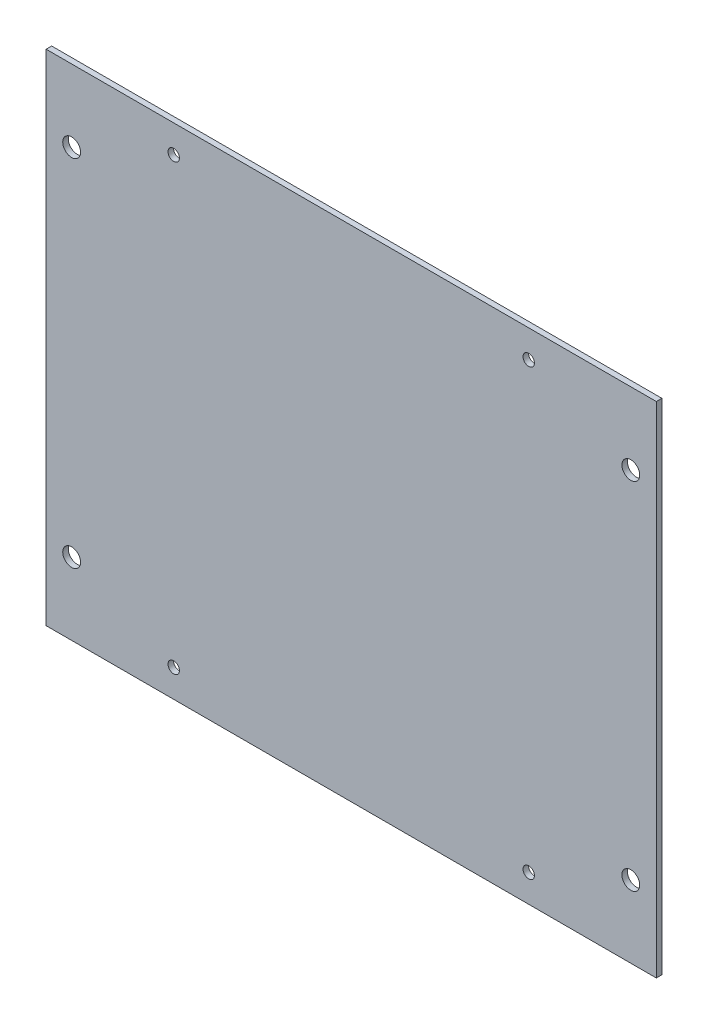
ISO-10303-21;
HEADER;
FILE_DESCRIPTION(('STEP AP214'),'2;1');
FILE_NAME('part.step','',(''),(''),'','','');
FILE_SCHEMA(('AUTOMOTIVE_DESIGN { 1 0 10303 214 1 1 1 1 }'));
ENDSEC;
DATA;
#1=APPLICATION_CONTEXT('core data for automotive mechanical design processes');
#2=APPLICATION_PROTOCOL_DEFINITION('international standard','automotive_design',2000,#1);
#3=PRODUCT_CONTEXT('',#1,'mechanical');
#4=PRODUCT('Part','Part','',(#3));
#5=PRODUCT_RELATED_PRODUCT_CATEGORY('part','',(#4));
#6=PRODUCT_DEFINITION_FORMATION('','',#4);
#7=PRODUCT_DEFINITION_CONTEXT('part definition',#1,'design');
#8=PRODUCT_DEFINITION('design','',#6,#7);
#9=PRODUCT_DEFINITION_SHAPE('','',#8);
#10=(LENGTH_UNIT() NAMED_UNIT(*) SI_UNIT(.MILLI.,.METRE.));
#11=(NAMED_UNIT(*) PLANE_ANGLE_UNIT() SI_UNIT($,.RADIAN.));
#12=(NAMED_UNIT(*) SI_UNIT($,.STERADIAN.) SOLID_ANGLE_UNIT());
#13=UNCERTAINTY_MEASURE_WITH_UNIT(LENGTH_MEASURE(1.E-05),#10,'distance_accuracy_value','');
#14=(GEOMETRIC_REPRESENTATION_CONTEXT(3) GLOBAL_UNCERTAINTY_ASSIGNED_CONTEXT((#13)) GLOBAL_UNIT_ASSIGNED_CONTEXT((#10,
#11,#12)) REPRESENTATION_CONTEXT('',''));
#15=CARTESIAN_POINT('',(0.,0.,0.));
#16=DIRECTION('',(0.,0.,1.));
#17=DIRECTION('',(1.,0.,0.));
#18=AXIS2_PLACEMENT_3D('',#15,#16,#17);
#19=CARTESIAN_POINT('',(0.,0.,0.79375));
#20=DIRECTION('',(0.,0.,1.));
#21=DIRECTION('',(1.,0.,0.));
#22=AXIS2_PLACEMENT_3D('',#19,#20,#21);
#23=PLANE('',#22);
#24=CARTESIAN_POINT('',(-220.027325222367,1.5302583045204,0.79375));
#25=DIRECTION('',(0.,0.,-1.));
#26=DIRECTION('',(-1.,0.,0.));
#27=AXIS2_PLACEMENT_3D('',#24,#25,#26);
#28=CIRCLE('',#27,2.55269999999999);
#29=CARTESIAN_POINT('',(-222.580025222367,1.5302583045204,0.79375));
#30=VERTEX_POINT('',#29);
#31=EDGE_CURVE('E163',#30,#30,#28,.T.);
#32=ORIENTED_EDGE('',*,*,#31,.T.);
#33=EDGE_LOOP('',(#32));
#34=FACE_BOUND('',#33,.T.);
#35=CARTESIAN_POINT('',(-220.027325222367,103.129958818751,0.79375));
#36=DIRECTION('',(0.,0.,-1.));
#37=DIRECTION('',(-1.,0.,0.));
#38=AXIS2_PLACEMENT_3D('',#35,#36,#37);
#39=CIRCLE('',#38,2.55269999999999);
#40=CARTESIAN_POINT('',(-222.580025222367,103.129958818751,0.79375));
#41=VERTEX_POINT('',#40);
#42=EDGE_CURVE('E157',#41,#41,#39,.T.);
#43=ORIENTED_EDGE('',*,*,#42,.T.);
#44=EDGE_LOOP('',(#43));
#45=FACE_BOUND('',#44,.T.);
#46=CARTESIAN_POINT('',(-380.04732575767,103.130259319268,0.79375));
#47=DIRECTION('',(0.,0.,-1.));
#48=DIRECTION('',(-1.,0.,0.));
#49=AXIS2_PLACEMENT_3D('',#46,#47,#48);
#50=CIRCLE('',#49,2.55270000000002);
#51=CARTESIAN_POINT('',(-382.60002575767,103.130259319268,0.79375));
#52=VERTEX_POINT('',#51);
#53=EDGE_CURVE('E151',#52,#52,#50,.T.);
#54=ORIENTED_EDGE('',*,*,#53,.T.);
#55=EDGE_LOOP('',(#54));
#56=FACE_BOUND('',#55,.T.);
#57=CARTESIAN_POINT('',(-380.047325769816,1.53055880503732,0.79375));
#58=DIRECTION('',(0.,0.,-1.));
#59=DIRECTION('',(-1.,0.,0.));
#60=AXIS2_PLACEMENT_3D('',#57,#58,#59);
#61=CIRCLE('',#60,2.55270000000002);
#62=CARTESIAN_POINT('',(-382.600025769816,1.53055880503732,0.79375));
#63=VERTEX_POINT('',#62);
#64=EDGE_CURVE('E145',#63,#63,#61,.T.);
#65=ORIENTED_EDGE('',*,*,#64,.T.);
#66=EDGE_LOOP('',(#65));
#67=FACE_BOUND('',#66,.T.);
#68=CARTESIAN_POINT('',(-350.837325504442,115.830258818593,0.793749999999999));
#69=DIRECTION('',(0.,0.,-1.));
#70=DIRECTION('',(-1.,0.,0.));
#71=AXIS2_PLACEMENT_3D('',#68,#69,#70);
#72=CIRCLE('',#71,1.63194999999999);
#73=CARTESIAN_POINT('',(-352.469275504442,115.830258818593,0.793749999999999));
#74=VERTEX_POINT('',#73);
#75=EDGE_CURVE('E139',#74,#74,#72,.T.);
#76=ORIENTED_EDGE('',*,*,#75,.T.);
#77=EDGE_LOOP('',(#76));
#78=FACE_BOUND('',#77,.T.);
#79=CARTESIAN_POINT('',(-249.237325504442,115.830258806447,0.793749999999999));
#80=DIRECTION('',(0.,0.,-1.));
#81=DIRECTION('',(-1.,0.,0.));
#82=AXIS2_PLACEMENT_3D('',#79,#80,#81);
#83=CIRCLE('',#82,1.63194999999999);
#84=CARTESIAN_POINT('',(-250.869275504442,115.830258806447,0.793749999999999));
#85=VERTEX_POINT('',#84);
#86=EDGE_CURVE('E133',#85,#85,#83,.T.);
#87=ORIENTED_EDGE('',*,*,#86,.T.);
#88=EDGE_LOOP('',(#87));
#89=FACE_BOUND('',#88,.T.);
#90=CARTESIAN_POINT('',(-249.237325519625,-11.1697411935534,0.793749999999999));
#91=DIRECTION('',(0.,0.,-1.));
#92=DIRECTION('',(-1.,0.,0.));
#93=AXIS2_PLACEMENT_3D('',#90,#91,#92);
#94=CIRCLE('',#93,1.63194999999999);
#95=CARTESIAN_POINT('',(-250.869275519625,-11.1697411935534,0.793749999999999));
#96=VERTEX_POINT('',#95);
#97=EDGE_CURVE('E127',#96,#96,#94,.T.);
#98=ORIENTED_EDGE('',*,*,#97,.T.);
#99=EDGE_LOOP('',(#98));
#100=FACE_BOUND('',#99,.T.);
#101=DIRECTION('',(-1.,-2.17085555104682E-12,0.));
#102=VECTOR('',#101,1.);
#103=CARTESIAN_POINT('',(-2.68681926259786E-10,123.767758812982,0.79375));
#104=LINE('',#103,#102);
#105=CARTESIAN_POINT('',(-212.724825222367,123.76775881252,0.79375));
#106=VERTEX_POINT('',#105);
#107=CARTESIAN_POINT('',(-387.349825755203,123.767758812141,0.79375));
#108=VERTEX_POINT('',#107);
#109=EDGE_CURVE('E110',#106,#108,#104,.T.);
#110=ORIENTED_EDGE('',*,*,#109,.T.);
#111=DIRECTION('',(-1.19551690409881E-10,-1.,0.));
#112=VECTOR('',#111,1.);
#113=CARTESIAN_POINT('',(-387.349825769999,4.63083264507762E-08,0.79375));
#114=LINE('',#113,#112);
#115=CARTESIAN_POINT('',(-387.349825772284,-19.1072411878587,0.79375));
#116=VERTEX_POINT('',#115);
#117=EDGE_CURVE('E12',#108,#116,#114,.T.);
#118=ORIENTED_EDGE('',*,*,#117,.T.);
#119=DIRECTION('',(1.,2.17061713501032E-12,0.));
#120=VECTOR('',#119,1.);
#121=CARTESIAN_POINT('',(4.14745051233162E-11,-19.107241187018,0.79375));
#122=LINE('',#121,#120);
#123=CARTESIAN_POINT('',(-212.724825222367,-19.1072411874797,0.79375));
#124=VERTEX_POINT('',#123);
#125=EDGE_CURVE('E53',#116,#124,#122,.T.);
#126=ORIENTED_EDGE('',*,*,#125,.T.);
#127=DIRECTION('',(0.,1.,0.));
#128=VECTOR('',#127,1.);
#129=CARTESIAN_POINT('',(-212.724825222367,0.,0.79375));
#130=LINE('',#129,#128);
#131=EDGE_CURVE('E89',#124,#106,#130,.T.);
#132=ORIENTED_EDGE('',*,*,#131,.T.);
#133=EDGE_LOOP('',(#110,#118,#126,#132));
#134=FACE_BOUND('',#133,.T.);
#135=CARTESIAN_POINT('',(-350.837325519625,-11.169741181407,0.793749999999999));
#136=DIRECTION('',(0.,0.,-1.));
#137=DIRECTION('',(-1.,0.,0.));
#138=AXIS2_PLACEMENT_3D('',#135,#136,#137);
#139=CIRCLE('',#138,1.63194999999999);
#140=CARTESIAN_POINT('',(-352.469275519625,-11.169741181407,0.793749999999999));
#141=VERTEX_POINT('',#140);
#142=EDGE_CURVE('E120',#141,#141,#139,.T.);
#143=ORIENTED_EDGE('',*,*,#142,.T.);
#144=EDGE_LOOP('',(#143));
#145=FACE_BOUND('',#144,.T.);
#146=ADVANCED_FACE('F45',(#34,#45,#56,#67,#78,#89,#100,#134,#145),#23,.T.);
#147=CARTESIAN_POINT('',(0.,0.,-0.79375));
#148=DIRECTION('',(0.,0.,1.));
#149=DIRECTION('',(1.,0.,0.));
#150=AXIS2_PLACEMENT_3D('',#147,#148,#149);
#151=PLANE('',#150);
#152=CARTESIAN_POINT('',(-220.027325222367,1.5302583045204,-0.793750000000001));
#153=DIRECTION('',(0.,0.,-1.));
#154=DIRECTION('',(-1.,0.,0.));
#155=AXIS2_PLACEMENT_3D('',#152,#153,#154);
#156=CIRCLE('',#155,2.55269999999999);
#157=CARTESIAN_POINT('',(-222.580025222367,1.5302583045204,-0.793750000000001));
#158=VERTEX_POINT('',#157);
#159=EDGE_CURVE('E166',#158,#158,#156,.T.);
#160=ORIENTED_EDGE('',*,*,#159,.F.);
#161=EDGE_LOOP('',(#160));
#162=FACE_BOUND('',#161,.T.);
#163=CARTESIAN_POINT('',(-220.027325222367,103.129958818751,-0.793750000000001));
#164=DIRECTION('',(0.,0.,-1.));
#165=DIRECTION('',(-1.,0.,0.));
#166=AXIS2_PLACEMENT_3D('',#163,#164,#165);
#167=CIRCLE('',#166,2.55269999999999);
#168=CARTESIAN_POINT('',(-222.580025222367,103.129958818751,-0.793750000000001));
#169=VERTEX_POINT('',#168);
#170=EDGE_CURVE('E160',#169,#169,#167,.T.);
#171=ORIENTED_EDGE('',*,*,#170,.F.);
#172=EDGE_LOOP('',(#171));
#173=FACE_BOUND('',#172,.T.);
#174=CARTESIAN_POINT('',(-380.04732575767,103.130259319268,-0.793750000000001));
#175=DIRECTION('',(0.,0.,-1.));
#176=DIRECTION('',(-1.,0.,0.));
#177=AXIS2_PLACEMENT_3D('',#174,#175,#176);
#178=CIRCLE('',#177,2.55269999999996);
#179=CARTESIAN_POINT('',(-382.60002575767,103.130259319268,-0.793750000000001));
#180=VERTEX_POINT('',#179);
#181=EDGE_CURVE('E154',#180,#180,#178,.T.);
#182=ORIENTED_EDGE('',*,*,#181,.F.);
#183=EDGE_LOOP('',(#182));
#184=FACE_BOUND('',#183,.T.);
#185=CARTESIAN_POINT('',(-380.047325769816,1.53055880503732,-0.793750000000001));
#186=DIRECTION('',(0.,0.,-1.));
#187=DIRECTION('',(-1.,0.,0.));
#188=AXIS2_PLACEMENT_3D('',#185,#186,#187);
#189=CIRCLE('',#188,2.55269999999996);
#190=CARTESIAN_POINT('',(-382.600025769816,1.53055880503732,-0.793750000000001));
#191=VERTEX_POINT('',#190);
#192=EDGE_CURVE('E148',#191,#191,#189,.T.);
#193=ORIENTED_EDGE('',*,*,#192,.F.);
#194=EDGE_LOOP('',(#193));
#195=FACE_BOUND('',#194,.T.);
#196=CARTESIAN_POINT('',(-350.837325504442,115.830258818593,-0.793750000000001));
#197=DIRECTION('',(0.,0.,-1.));
#198=DIRECTION('',(-1.,0.,0.));
#199=AXIS2_PLACEMENT_3D('',#196,#197,#198);
#200=CIRCLE('',#199,1.63194999999999);
#201=CARTESIAN_POINT('',(-352.469275504442,115.830258818593,-0.793750000000001));
#202=VERTEX_POINT('',#201);
#203=EDGE_CURVE('E142',#202,#202,#200,.T.);
#204=ORIENTED_EDGE('',*,*,#203,.F.);
#205=EDGE_LOOP('',(#204));
#206=FACE_BOUND('',#205,.T.);
#207=CARTESIAN_POINT('',(-249.237325504442,115.830258806447,-0.793750000000001));
#208=DIRECTION('',(0.,0.,-1.));
#209=DIRECTION('',(-1.,0.,0.));
#210=AXIS2_PLACEMENT_3D('',#207,#208,#209);
#211=CIRCLE('',#210,1.63194999999999);
#212=CARTESIAN_POINT('',(-250.869275504442,115.830258806447,-0.793750000000001));
#213=VERTEX_POINT('',#212);
#214=EDGE_CURVE('E136',#213,#213,#211,.T.);
#215=ORIENTED_EDGE('',*,*,#214,.F.);
#216=EDGE_LOOP('',(#215));
#217=FACE_BOUND('',#216,.T.);
#218=CARTESIAN_POINT('',(-249.237325519625,-11.1697411935534,-0.793750000000001));
#219=DIRECTION('',(0.,0.,-1.));
#220=DIRECTION('',(-1.,0.,0.));
#221=AXIS2_PLACEMENT_3D('',#218,#219,#220);
#222=CIRCLE('',#221,1.63194999999999);
#223=CARTESIAN_POINT('',(-250.869275519625,-11.1697411935534,-0.793750000000001));
#224=VERTEX_POINT('',#223);
#225=EDGE_CURVE('E130',#224,#224,#222,.T.);
#226=ORIENTED_EDGE('',*,*,#225,.F.);
#227=EDGE_LOOP('',(#226));
#228=FACE_BOUND('',#227,.T.);
#229=CARTESIAN_POINT('',(-350.837325519625,-11.169741181407,-0.793750000000001));
#230=DIRECTION('',(0.,0.,-1.));
#231=DIRECTION('',(-1.,0.,0.));
#232=AXIS2_PLACEMENT_3D('',#229,#230,#231);
#233=CIRCLE('',#232,1.63194999999999);
#234=CARTESIAN_POINT('',(-352.469275519625,-11.169741181407,-0.793750000000001));
#235=VERTEX_POINT('',#234);
#236=EDGE_CURVE('E122',#235,#235,#233,.T.);
#237=ORIENTED_EDGE('',*,*,#236,.F.);
#238=EDGE_LOOP('',(#237));
#239=FACE_BOUND('',#238,.T.);
#240=DIRECTION('',(1.19551690409881E-10,1.,0.));
#241=VECTOR('',#240,1.);
#242=CARTESIAN_POINT('',(-387.349825755203,123.767758812141,-0.79375));
#243=LINE('',#242,#241);
#244=CARTESIAN_POINT('',(-387.349825772284,-19.1072411878587,-0.79375));
#245=VERTEX_POINT('',#244);
#246=CARTESIAN_POINT('',(-387.349825755203,123.767758812141,-0.79375));
#247=VERTEX_POINT('',#246);
#248=EDGE_CURVE('E106',#245,#247,#243,.T.);
#249=ORIENTED_EDGE('',*,*,#248,.T.);
#250=DIRECTION('',(1.,2.17085555104682E-12,0.));
#251=VECTOR('',#250,1.);
#252=CARTESIAN_POINT('',(-212.724825222367,123.76775881252,-0.79375));
#253=LINE('',#252,#251);
#254=CARTESIAN_POINT('',(-212.724825222367,123.76775881252,-0.79375));
#255=VERTEX_POINT('',#254);
#256=EDGE_CURVE('E104',#247,#255,#253,.T.);
#257=ORIENTED_EDGE('',*,*,#256,.T.);
#258=DIRECTION('',(0.,-1.,0.));
#259=VECTOR('',#258,1.);
#260=CARTESIAN_POINT('',(-212.724825222367,-19.1072411874797,-0.79375));
#261=LINE('',#260,#259);
#262=CARTESIAN_POINT('',(-212.724825222367,-19.1072411874797,-0.79375));
#263=VERTEX_POINT('',#262);
#264=EDGE_CURVE('E68',#255,#263,#261,.T.);
#265=ORIENTED_EDGE('',*,*,#264,.T.);
#266=DIRECTION('',(-1.,-2.17061713501032E-12,0.));
#267=VECTOR('',#266,1.);
#268=CARTESIAN_POINT('',(-387.349825772284,-19.1072411878587,-0.79375));
#269=LINE('',#268,#267);
#270=EDGE_CURVE('E96',#263,#245,#269,.T.);
#271=ORIENTED_EDGE('',*,*,#270,.T.);
#272=EDGE_LOOP('',(#249,#257,#265,#271));
#273=FACE_BOUND('',#272,.T.);
#274=ADVANCED_FACE('F47',(#162,#173,#184,#195,#206,#217,#228,#239,#273),#151,.F.);
#275=CARTESIAN_POINT('',(-387.349825755203,123.767758812141,1.74625));
#276=DIRECTION('',(-1.,1.19551690409881E-10,0.));
#277=DIRECTION('',(-1.19551690409881E-10,-1.,0.));
#278=AXIS2_PLACEMENT_3D('',#275,#276,#277);
#279=PLANE('',#278);
#280=DIRECTION('',(0.,0.,-1.));
#281=VECTOR('',#280,1.);
#282=CARTESIAN_POINT('',(-387.349825755203,123.767758812141,1.74625));
#283=LINE('',#282,#281);
#284=EDGE_CURVE('E60',#108,#247,#283,.T.);
#285=ORIENTED_EDGE('',*,*,#284,.T.);
#286=ORIENTED_EDGE('',*,*,#248,.F.);
#287=DIRECTION('',(0.,0.,-1.));
#288=VECTOR('',#287,1.);
#289=CARTESIAN_POINT('',(-387.349825772284,-19.1072411878587,1.74625));
#290=LINE('',#289,#288);
#291=EDGE_CURVE('E92',#116,#245,#290,.T.);
#292=ORIENTED_EDGE('',*,*,#291,.F.);
#293=ORIENTED_EDGE('',*,*,#117,.F.);
#294=EDGE_LOOP('',(#285,#286,#292,#293));
#295=FACE_BOUND('',#294,.T.);
#296=ADVANCED_FACE('F119',(#295),#279,.T.);
#297=CARTESIAN_POINT('',(-387.349825772284,-19.1072411878587,1.74625));
#298=DIRECTION('',(2.17061713501032E-12,-1.,0.));
#299=DIRECTION('',(1.,2.17061713501032E-12,0.));
#300=AXIS2_PLACEMENT_3D('',#297,#298,#299);
#301=PLANE('',#300);
#302=ORIENTED_EDGE('',*,*,#291,.T.);
#303=ORIENTED_EDGE('',*,*,#270,.F.);
#304=DIRECTION('',(0.,0.,-1.));
#305=VECTOR('',#304,1.);
#306=CARTESIAN_POINT('',(-212.724825222367,-19.1072411874797,1.74625));
#307=LINE('',#306,#305);
#308=EDGE_CURVE('E85',#124,#263,#307,.T.);
#309=ORIENTED_EDGE('',*,*,#308,.F.);
#310=ORIENTED_EDGE('',*,*,#125,.F.);
#311=EDGE_LOOP('',(#302,#303,#309,#310));
#312=FACE_BOUND('',#311,.T.);
#313=ADVANCED_FACE('F97',(#312),#301,.T.);
#314=CARTESIAN_POINT('',(-212.724825222367,-19.1072411874797,1.74625));
#315=DIRECTION('',(1.,0.,0.));
#316=DIRECTION('',(0.,1.,0.));
#317=AXIS2_PLACEMENT_3D('',#314,#315,#316);
#318=PLANE('',#317);
#319=ORIENTED_EDGE('',*,*,#308,.T.);
#320=ORIENTED_EDGE('',*,*,#264,.F.);
#321=DIRECTION('',(0.,0.,-1.));
#322=VECTOR('',#321,1.);
#323=CARTESIAN_POINT('',(-212.724825222367,123.76775881252,1.74625));
#324=LINE('',#323,#322);
#325=EDGE_CURVE('E93',#106,#255,#324,.T.);
#326=ORIENTED_EDGE('',*,*,#325,.F.);
#327=ORIENTED_EDGE('',*,*,#131,.F.);
#328=EDGE_LOOP('',(#319,#320,#326,#327));
#329=FACE_BOUND('',#328,.T.);
#330=ADVANCED_FACE('F87',(#329),#318,.T.);
#331=CARTESIAN_POINT('',(-212.724825222367,123.76775881252,1.74625));
#332=DIRECTION('',(-2.17085555104682E-12,1.,0.));
#333=DIRECTION('',(-1.,-2.17085555104682E-12,0.));
#334=AXIS2_PLACEMENT_3D('',#331,#332,#333);
#335=PLANE('',#334);
#336=ORIENTED_EDGE('',*,*,#325,.T.);
#337=ORIENTED_EDGE('',*,*,#256,.F.);
#338=ORIENTED_EDGE('',*,*,#284,.F.);
#339=ORIENTED_EDGE('',*,*,#109,.F.);
#340=EDGE_LOOP('',(#336,#337,#338,#339));
#341=FACE_BOUND('',#340,.T.);
#342=ADVANCED_FACE('F191',(#341),#335,.T.);
#343=CARTESIAN_POINT('',(-350.837325519625,-11.169741181407,-0.79375));
#344=DIRECTION('',(0.,0.,-1.));
#345=DIRECTION('',(-1.,0.,0.));
#346=AXIS2_PLACEMENT_3D('',#343,#344,#345);
#347=CYLINDRICAL_SURFACE('',#346,1.63194999999999);
#348=ORIENTED_EDGE('',*,*,#142,.F.);
#349=EDGE_LOOP('',(#348));
#350=FACE_BOUND('',#349,.T.);
#351=ORIENTED_EDGE('',*,*,#236,.T.);
#352=EDGE_LOOP('',(#351));
#353=FACE_BOUND('',#352,.T.);
#354=ADVANCED_FACE('F188',(#350,#353),#347,.F.);
#355=CARTESIAN_POINT('',(-249.237325519625,-11.1697411935534,-0.79375));
#356=DIRECTION('',(0.,0.,-1.));
#357=DIRECTION('',(-1.,0.,0.));
#358=AXIS2_PLACEMENT_3D('',#355,#356,#357);
#359=CYLINDRICAL_SURFACE('',#358,1.63194999999999);
#360=ORIENTED_EDGE('',*,*,#97,.F.);
#361=EDGE_LOOP('',(#360));
#362=FACE_BOUND('',#361,.T.);
#363=ORIENTED_EDGE('',*,*,#225,.T.);
#364=EDGE_LOOP('',(#363));
#365=FACE_BOUND('',#364,.T.);
#366=ADVANCED_FACE('F190',(#362,#365),#359,.F.);
#367=CARTESIAN_POINT('',(-249.237325504442,115.830258806447,-0.79375));
#368=DIRECTION('',(0.,0.,-1.));
#369=DIRECTION('',(-1.,0.,0.));
#370=AXIS2_PLACEMENT_3D('',#367,#368,#369);
#371=CYLINDRICAL_SURFACE('',#370,1.63194999999999);
#372=ORIENTED_EDGE('',*,*,#86,.F.);
#373=EDGE_LOOP('',(#372));
#374=FACE_BOUND('',#373,.T.);
#375=ORIENTED_EDGE('',*,*,#214,.T.);
#376=EDGE_LOOP('',(#375));
#377=FACE_BOUND('',#376,.T.);
#378=ADVANCED_FACE('F198',(#374,#377),#371,.F.);
#379=CARTESIAN_POINT('',(-350.837325504442,115.830258818593,-0.79375));
#380=DIRECTION('',(0.,0.,-1.));
#381=DIRECTION('',(-1.,0.,0.));
#382=AXIS2_PLACEMENT_3D('',#379,#380,#381);
#383=CYLINDRICAL_SURFACE('',#382,1.63194999999999);
#384=ORIENTED_EDGE('',*,*,#75,.F.);
#385=EDGE_LOOP('',(#384));
#386=FACE_BOUND('',#385,.T.);
#387=ORIENTED_EDGE('',*,*,#203,.T.);
#388=EDGE_LOOP('',(#387));
#389=FACE_BOUND('',#388,.T.);
#390=ADVANCED_FACE('F249',(#386,#389),#383,.F.);
#391=CARTESIAN_POINT('',(-380.047325769816,1.53055880503732,-0.79375));
#392=DIRECTION('',(0.,0.,-1.));
#393=DIRECTION('',(-1.,0.,0.));
#394=AXIS2_PLACEMENT_3D('',#391,#392,#393);
#395=CYLINDRICAL_SURFACE('',#394,2.55269999999999);
#396=ORIENTED_EDGE('',*,*,#64,.F.);
#397=EDGE_LOOP('',(#396));
#398=FACE_BOUND('',#397,.T.);
#399=ORIENTED_EDGE('',*,*,#192,.T.);
#400=EDGE_LOOP('',(#399));
#401=FACE_BOUND('',#400,.T.);
#402=ADVANCED_FACE('F259',(#398,#401),#395,.F.);
#403=CARTESIAN_POINT('',(-380.04732575767,103.130259319268,-0.79375));
#404=DIRECTION('',(0.,0.,-1.));
#405=DIRECTION('',(-1.,0.,0.));
#406=AXIS2_PLACEMENT_3D('',#403,#404,#405);
#407=CYLINDRICAL_SURFACE('',#406,2.55269999999999);
#408=ORIENTED_EDGE('',*,*,#53,.F.);
#409=EDGE_LOOP('',(#408));
#410=FACE_BOUND('',#409,.T.);
#411=ORIENTED_EDGE('',*,*,#181,.T.);
#412=EDGE_LOOP('',(#411));
#413=FACE_BOUND('',#412,.T.);
#414=ADVANCED_FACE('F271',(#410,#413),#407,.F.);
#415=CARTESIAN_POINT('',(-220.027325222367,103.129958818751,-0.79375));
#416=DIRECTION('',(0.,0.,-1.));
#417=DIRECTION('',(-1.,0.,0.));
#418=AXIS2_PLACEMENT_3D('',#415,#416,#417);
#419=CYLINDRICAL_SURFACE('',#418,2.55269999999999);
#420=ORIENTED_EDGE('',*,*,#42,.F.);
#421=EDGE_LOOP('',(#420));
#422=FACE_BOUND('',#421,.T.);
#423=ORIENTED_EDGE('',*,*,#170,.T.);
#424=EDGE_LOOP('',(#423));
#425=FACE_BOUND('',#424,.T.);
#426=ADVANCED_FACE('F278',(#422,#425),#419,.F.);
#427=CARTESIAN_POINT('',(-220.027325222367,1.5302583045204,-0.79375));
#428=DIRECTION('',(0.,0.,-1.));
#429=DIRECTION('',(-1.,0.,0.));
#430=AXIS2_PLACEMENT_3D('',#427,#428,#429);
#431=CYLINDRICAL_SURFACE('',#430,2.55269999999999);
#432=ORIENTED_EDGE('',*,*,#31,.F.);
#433=EDGE_LOOP('',(#432));
#434=FACE_BOUND('',#433,.T.);
#435=ORIENTED_EDGE('',*,*,#159,.T.);
#436=EDGE_LOOP('',(#435));
#437=FACE_BOUND('',#436,.T.);
#438=ADVANCED_FACE('F170',(#434,#437),#431,.F.);
#439=CLOSED_SHELL('',(#146,#274,#296,#313,#330,#342,#354,#366,#378,#390,#402,#414,#426,#438));
#440=MANIFOLD_SOLID_BREP('B2',#439);
#441=ADVANCED_BREP_SHAPE_REPRESENTATION('',(#18,#440),#14);
#442=SHAPE_DEFINITION_REPRESENTATION(#9,#441);
ENDSEC;
END-ISO-10303-21;
